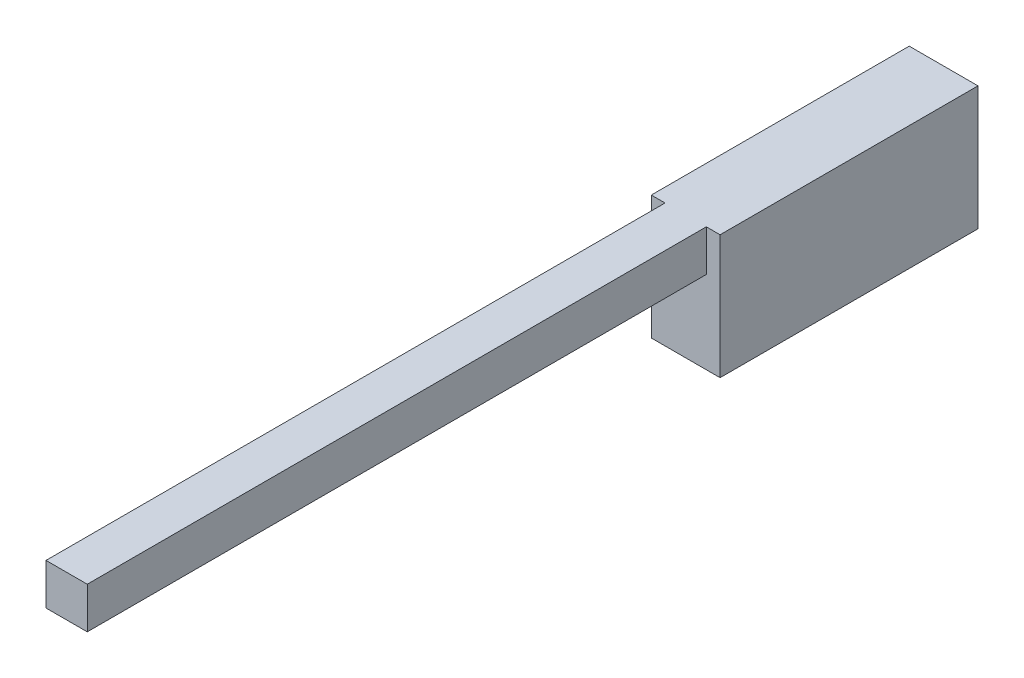
ISO-10303-21;
HEADER;
FILE_DESCRIPTION(('STEP AP214'),'2;1');
FILE_NAME('part.step','',(''),(''),'','','');
FILE_SCHEMA(('AUTOMOTIVE_DESIGN { 1 0 10303 214 1 1 1 1 }'));
ENDSEC;
DATA;
#1=APPLICATION_CONTEXT('core data for automotive mechanical design processes');
#2=APPLICATION_PROTOCOL_DEFINITION('international standard','automotive_design',2000,#1);
#3=PRODUCT_CONTEXT('',#1,'mechanical');
#4=PRODUCT('Part','Part','',(#3));
#5=PRODUCT_RELATED_PRODUCT_CATEGORY('part','',(#4));
#6=PRODUCT_DEFINITION_FORMATION('','',#4);
#7=PRODUCT_DEFINITION_CONTEXT('part definition',#1,'design');
#8=PRODUCT_DEFINITION('design','',#6,#7);
#9=PRODUCT_DEFINITION_SHAPE('','',#8);
#10=(LENGTH_UNIT() NAMED_UNIT(*) SI_UNIT(.MILLI.,.METRE.));
#11=(NAMED_UNIT(*) PLANE_ANGLE_UNIT() SI_UNIT($,.RADIAN.));
#12=(NAMED_UNIT(*) SI_UNIT($,.STERADIAN.) SOLID_ANGLE_UNIT());
#13=UNCERTAINTY_MEASURE_WITH_UNIT(LENGTH_MEASURE(1.E-05),#10,'distance_accuracy_value','');
#14=(GEOMETRIC_REPRESENTATION_CONTEXT(3) GLOBAL_UNCERTAINTY_ASSIGNED_CONTEXT((#13)) GLOBAL_UNIT_ASSIGNED_CONTEXT((#10,
#11,#12)) REPRESENTATION_CONTEXT('',''));
#15=CARTESIAN_POINT('',(0.,0.,0.));
#16=DIRECTION('',(0.,0.,1.));
#17=DIRECTION('',(1.,0.,0.));
#18=AXIS2_PLACEMENT_3D('',#15,#16,#17);
#19=CARTESIAN_POINT('',(0.,0.,75.));
#20=DIRECTION('',(0.,0.,-1.));
#21=DIRECTION('',(-1.,0.,0.));
#22=AXIS2_PLACEMENT_3D('',#19,#20,#21);
#23=PLANE('',#22);
#24=DIRECTION('',(0.,-1.,0.));
#25=VECTOR('',#24,1.);
#26=CARTESIAN_POINT('',(4.,36.,75.));
#27=LINE('',#26,#25);
#28=CARTESIAN_POINT('',(4.,36.,75.));
#29=VERTEX_POINT('',#28);
#30=CARTESIAN_POINT('',(4.,24.,75.));
#31=VERTEX_POINT('',#30);
#32=EDGE_CURVE('E52',#29,#31,#27,.T.);
#33=ORIENTED_EDGE('',*,*,#32,.F.);
#34=DIRECTION('',(-1.,0.,0.));
#35=VECTOR('',#34,1.);
#36=CARTESIAN_POINT('',(0.,36.,75.));
#37=LINE('',#36,#35);
#38=CARTESIAN_POINT('',(0.,36.,75.));
#39=VERTEX_POINT('',#38);
#40=EDGE_CURVE('E134',#29,#39,#37,.T.);
#41=ORIENTED_EDGE('',*,*,#40,.T.);
#42=DIRECTION('',(0.,-1.,0.));
#43=VECTOR('',#42,1.);
#44=CARTESIAN_POINT('',(0.,0.,75.));
#45=LINE('',#44,#43);
#46=CARTESIAN_POINT('',(0.,0.,75.));
#47=VERTEX_POINT('',#46);
#48=EDGE_CURVE('E126',#39,#47,#45,.T.);
#49=ORIENTED_EDGE('',*,*,#48,.T.);
#50=DIRECTION('',(1.,0.,0.));
#51=VECTOR('',#50,1.);
#52=CARTESIAN_POINT('',(0.,0.,75.));
#53=LINE('',#52,#51);
#54=CARTESIAN_POINT('',(20.,0.,75.));
#55=VERTEX_POINT('',#54);
#56=EDGE_CURVE('E129',#47,#55,#53,.T.);
#57=ORIENTED_EDGE('',*,*,#56,.T.);
#58=DIRECTION('',(0.,1.,0.));
#59=VECTOR('',#58,1.);
#60=CARTESIAN_POINT('',(20.,0.,75.));
#61=LINE('',#60,#59);
#62=CARTESIAN_POINT('',(20.,36.,75.));
#63=VERTEX_POINT('',#62);
#64=EDGE_CURVE('E132',#55,#63,#61,.T.);
#65=ORIENTED_EDGE('',*,*,#64,.T.);
#66=CARTESIAN_POINT('',(16.,36.,75.));
#67=VERTEX_POINT('',#66);
#68=EDGE_CURVE('E135',#63,#67,#37,.T.);
#69=ORIENTED_EDGE('',*,*,#68,.T.);
#70=DIRECTION('',(0.,1.,0.));
#71=VECTOR('',#70,1.);
#72=CARTESIAN_POINT('',(16.,36.,75.));
#73=LINE('',#72,#71);
#74=CARTESIAN_POINT('',(16.,24.,75.));
#75=VERTEX_POINT('',#74);
#76=EDGE_CURVE('E114',#75,#67,#73,.T.);
#77=ORIENTED_EDGE('',*,*,#76,.F.);
#78=DIRECTION('',(1.,0.,0.));
#79=VECTOR('',#78,1.);
#80=CARTESIAN_POINT('',(4.,24.,75.));
#81=LINE('',#80,#79);
#82=EDGE_CURVE('E47',#31,#75,#81,.T.);
#83=ORIENTED_EDGE('',*,*,#82,.F.);
#84=EDGE_LOOP('',(#33,#41,#49,#57,#65,#69,#77,#83));
#85=FACE_BOUND('',#84,.T.);
#86=ADVANCED_FACE('F32',(#85),#23,.F.);
#87=CARTESIAN_POINT('',(0.,0.,75.));
#88=DIRECTION('',(1.,0.,0.));
#89=DIRECTION('',(0.,0.,-1.));
#90=AXIS2_PLACEMENT_3D('',#87,#88,#89);
#91=PLANE('',#90);
#92=DIRECTION('',(0.,-1.,0.));
#93=VECTOR('',#92,1.);
#94=CARTESIAN_POINT('',(0.,0.,0.));
#95=LINE('',#94,#93);
#96=CARTESIAN_POINT('',(0.,36.,0.));
#97=VERTEX_POINT('',#96);
#98=CARTESIAN_POINT('',(0.,0.,0.));
#99=VERTEX_POINT('',#98);
#100=EDGE_CURVE('E117',#97,#99,#95,.T.);
#101=ORIENTED_EDGE('',*,*,#100,.T.);
#102=DIRECTION('',(0.,0.,-1.));
#103=VECTOR('',#102,1.);
#104=CARTESIAN_POINT('',(0.,0.,75.));
#105=LINE('',#104,#103);
#106=EDGE_CURVE('E11',#47,#99,#105,.T.);
#107=ORIENTED_EDGE('',*,*,#106,.F.);
#108=ORIENTED_EDGE('',*,*,#48,.F.);
#109=DIRECTION('',(0.,0.,-1.));
#110=VECTOR('',#109,1.);
#111=CARTESIAN_POINT('',(0.,36.,75.));
#112=LINE('',#111,#110);
#113=EDGE_CURVE('E136',#39,#97,#112,.T.);
#114=ORIENTED_EDGE('',*,*,#113,.T.);
#115=EDGE_LOOP('',(#101,#107,#108,#114));
#116=FACE_BOUND('',#115,.T.);
#117=ADVANCED_FACE('F34',(#116),#91,.F.);
#118=CARTESIAN_POINT('',(0.,0.,75.));
#119=DIRECTION('',(0.,1.,0.));
#120=DIRECTION('',(0.,0.,1.));
#121=AXIS2_PLACEMENT_3D('',#118,#119,#120);
#122=PLANE('',#121);
#123=DIRECTION('',(1.,0.,0.));
#124=VECTOR('',#123,1.);
#125=CARTESIAN_POINT('',(0.,0.,0.));
#126=LINE('',#125,#124);
#127=CARTESIAN_POINT('',(20.,0.,0.));
#128=VERTEX_POINT('',#127);
#129=EDGE_CURVE('E120',#99,#128,#126,.T.);
#130=ORIENTED_EDGE('',*,*,#129,.T.);
#131=DIRECTION('',(0.,0.,-1.));
#132=VECTOR('',#131,1.);
#133=CARTESIAN_POINT('',(20.,0.,75.));
#134=LINE('',#133,#132);
#135=EDGE_CURVE('E40',#55,#128,#134,.T.);
#136=ORIENTED_EDGE('',*,*,#135,.F.);
#137=ORIENTED_EDGE('',*,*,#56,.F.);
#138=ORIENTED_EDGE('',*,*,#106,.T.);
#139=EDGE_LOOP('',(#130,#136,#137,#138));
#140=FACE_BOUND('',#139,.T.);
#141=ADVANCED_FACE('F190',(#140),#122,.F.);
#142=CARTESIAN_POINT('',(20.,0.,75.));
#143=DIRECTION('',(-1.,0.,0.));
#144=DIRECTION('',(0.,0.,1.));
#145=AXIS2_PLACEMENT_3D('',#142,#143,#144);
#146=PLANE('',#145);
#147=DIRECTION('',(0.,1.,0.));
#148=VECTOR('',#147,1.);
#149=CARTESIAN_POINT('',(20.,0.,0.));
#150=LINE('',#149,#148);
#151=CARTESIAN_POINT('',(20.,36.,0.));
#152=VERTEX_POINT('',#151);
#153=EDGE_CURVE('E139',#128,#152,#150,.T.);
#154=ORIENTED_EDGE('',*,*,#153,.T.);
#155=DIRECTION('',(0.,0.,-1.));
#156=VECTOR('',#155,1.);
#157=CARTESIAN_POINT('',(20.,36.,75.));
#158=LINE('',#157,#156);
#159=EDGE_CURVE('E144',#63,#152,#158,.T.);
#160=ORIENTED_EDGE('',*,*,#159,.F.);
#161=ORIENTED_EDGE('',*,*,#64,.F.);
#162=ORIENTED_EDGE('',*,*,#135,.T.);
#163=EDGE_LOOP('',(#154,#160,#161,#162));
#164=FACE_BOUND('',#163,.T.);
#165=ADVANCED_FACE('F151',(#164),#146,.F.);
#166=CARTESIAN_POINT('',(0.,36.,75.));
#167=DIRECTION('',(0.,-1.,0.));
#168=DIRECTION('',(0.,0.,-1.));
#169=AXIS2_PLACEMENT_3D('',#166,#167,#168);
#170=PLANE('',#169);
#171=DIRECTION('',(-1.,0.,0.));
#172=VECTOR('',#171,1.);
#173=CARTESIAN_POINT('',(0.,36.,0.));
#174=LINE('',#173,#172);
#175=EDGE_CURVE('E130',#152,#97,#174,.T.);
#176=ORIENTED_EDGE('',*,*,#175,.T.);
#177=ORIENTED_EDGE('',*,*,#113,.F.);
#178=ORIENTED_EDGE('',*,*,#40,.F.);
#179=DIRECTION('',(0.,0.,-1.));
#180=VECTOR('',#179,1.);
#181=CARTESIAN_POINT('',(4.,36.,255.));
#182=LINE('',#181,#180);
#183=CARTESIAN_POINT('',(4.,36.,255.));
#184=VERTEX_POINT('',#183);
#185=EDGE_CURVE('E165',#184,#29,#182,.T.);
#186=ORIENTED_EDGE('',*,*,#185,.F.);
#187=DIRECTION('',(-1.,0.,0.));
#188=VECTOR('',#187,1.);
#189=CARTESIAN_POINT('',(4.,36.,255.));
#190=LINE('',#189,#188);
#191=CARTESIAN_POINT('',(16.,36.,255.));
#192=VERTEX_POINT('',#191);
#193=EDGE_CURVE('E110',#192,#184,#190,.T.);
#194=ORIENTED_EDGE('',*,*,#193,.F.);
#195=DIRECTION('',(0.,0.,-1.));
#196=VECTOR('',#195,1.);
#197=CARTESIAN_POINT('',(16.,36.,255.));
#198=LINE('',#197,#196);
#199=EDGE_CURVE('E122',#192,#67,#198,.T.);
#200=ORIENTED_EDGE('',*,*,#199,.T.);
#201=ORIENTED_EDGE('',*,*,#68,.F.);
#202=ORIENTED_EDGE('',*,*,#159,.T.);
#203=EDGE_LOOP('',(#176,#177,#178,#186,#194,#200,#201,#202));
#204=FACE_BOUND('',#203,.T.);
#205=ADVANCED_FACE('F160',(#204),#170,.F.);
#206=CARTESIAN_POINT('',(0.,0.,0.));
#207=DIRECTION('',(0.,0.,-1.));
#208=DIRECTION('',(-1.,0.,0.));
#209=AXIS2_PLACEMENT_3D('',#206,#207,#208);
#210=PLANE('',#209);
#211=ORIENTED_EDGE('',*,*,#100,.F.);
#212=ORIENTED_EDGE('',*,*,#175,.F.);
#213=ORIENTED_EDGE('',*,*,#153,.F.);
#214=ORIENTED_EDGE('',*,*,#129,.F.);
#215=EDGE_LOOP('',(#211,#212,#213,#214));
#216=FACE_BOUND('',#215,.T.);
#217=ADVANCED_FACE('F157',(#216),#210,.T.);
#218=CARTESIAN_POINT('',(4.,36.,255.));
#219=DIRECTION('',(1.,0.,0.));
#220=DIRECTION('',(0.,0.,-1.));
#221=AXIS2_PLACEMENT_3D('',#218,#219,#220);
#222=PLANE('',#221);
#223=ORIENTED_EDGE('',*,*,#32,.T.);
#224=DIRECTION('',(0.,0.,-1.));
#225=VECTOR('',#224,1.);
#226=CARTESIAN_POINT('',(4.,24.,255.));
#227=LINE('',#226,#225);
#228=CARTESIAN_POINT('',(4.,24.,255.));
#229=VERTEX_POINT('',#228);
#230=EDGE_CURVE('E99',#229,#31,#227,.T.);
#231=ORIENTED_EDGE('',*,*,#230,.F.);
#232=DIRECTION('',(0.,-1.,0.));
#233=VECTOR('',#232,1.);
#234=CARTESIAN_POINT('',(4.,36.,255.));
#235=LINE('',#234,#233);
#236=EDGE_CURVE('E105',#184,#229,#235,.T.);
#237=ORIENTED_EDGE('',*,*,#236,.F.);
#238=ORIENTED_EDGE('',*,*,#185,.T.);
#239=EDGE_LOOP('',(#223,#231,#237,#238));
#240=FACE_BOUND('',#239,.T.);
#241=ADVANCED_FACE('F116',(#240),#222,.F.);
#242=CARTESIAN_POINT('',(4.,24.,255.));
#243=DIRECTION('',(0.,1.,0.));
#244=DIRECTION('',(0.,0.,1.));
#245=AXIS2_PLACEMENT_3D('',#242,#243,#244);
#246=PLANE('',#245);
#247=ORIENTED_EDGE('',*,*,#82,.T.);
#248=DIRECTION('',(0.,0.,-1.));
#249=VECTOR('',#248,1.);
#250=CARTESIAN_POINT('',(16.,24.,255.));
#251=LINE('',#250,#249);
#252=CARTESIAN_POINT('',(16.,24.,255.));
#253=VERTEX_POINT('',#252);
#254=EDGE_CURVE('E101',#253,#75,#251,.T.);
#255=ORIENTED_EDGE('',*,*,#254,.F.);
#256=DIRECTION('',(1.,0.,0.));
#257=VECTOR('',#256,1.);
#258=CARTESIAN_POINT('',(4.,24.,255.));
#259=LINE('',#258,#257);
#260=EDGE_CURVE('E95',#229,#253,#259,.T.);
#261=ORIENTED_EDGE('',*,*,#260,.F.);
#262=ORIENTED_EDGE('',*,*,#230,.T.);
#263=EDGE_LOOP('',(#247,#255,#261,#262));
#264=FACE_BOUND('',#263,.T.);
#265=ADVANCED_FACE('F97',(#264),#246,.F.);
#266=CARTESIAN_POINT('',(16.,36.,255.));
#267=DIRECTION('',(-1.,0.,0.));
#268=DIRECTION('',(0.,0.,1.));
#269=AXIS2_PLACEMENT_3D('',#266,#267,#268);
#270=PLANE('',#269);
#271=ORIENTED_EDGE('',*,*,#76,.T.);
#272=ORIENTED_EDGE('',*,*,#199,.F.);
#273=DIRECTION('',(0.,1.,0.));
#274=VECTOR('',#273,1.);
#275=CARTESIAN_POINT('',(16.,36.,255.));
#276=LINE('',#275,#274);
#277=EDGE_CURVE('E104',#253,#192,#276,.T.);
#278=ORIENTED_EDGE('',*,*,#277,.F.);
#279=ORIENTED_EDGE('',*,*,#254,.T.);
#280=EDGE_LOOP('',(#271,#272,#278,#279));
#281=FACE_BOUND('',#280,.T.);
#282=ADVANCED_FACE('F176',(#281),#270,.F.);
#283=CARTESIAN_POINT('',(0.,0.,255.));
#284=DIRECTION('',(0.,0.,1.));
#285=DIRECTION('',(1.,0.,0.));
#286=AXIS2_PLACEMENT_3D('',#283,#284,#285);
#287=PLANE('',#286);
#288=ORIENTED_EDGE('',*,*,#236,.T.);
#289=ORIENTED_EDGE('',*,*,#260,.T.);
#290=ORIENTED_EDGE('',*,*,#277,.T.);
#291=ORIENTED_EDGE('',*,*,#193,.T.);
#292=EDGE_LOOP('',(#288,#289,#290,#291));
#293=FACE_BOUND('',#292,.T.);
#294=ADVANCED_FACE('F108',(#293),#287,.T.);
#295=CLOSED_SHELL('',(#86,#117,#141,#165,#205,#217,#241,#265,#282,#294));
#296=MANIFOLD_SOLID_BREP('B2',#295);
#297=ADVANCED_BREP_SHAPE_REPRESENTATION('',(#18,#296),#14);
#298=SHAPE_DEFINITION_REPRESENTATION(#9,#297);
ENDSEC;
END-ISO-10303-21;
